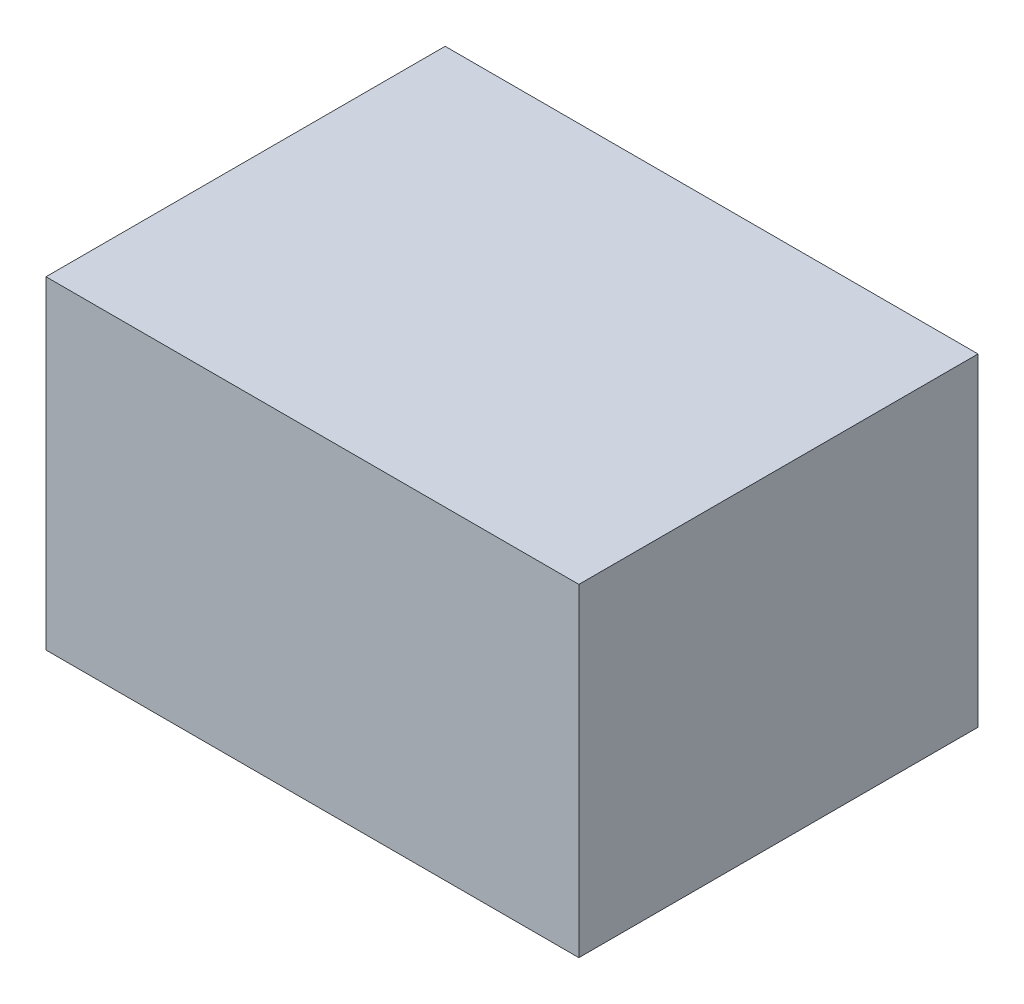
ISO-10303-21;
HEADER;
FILE_DESCRIPTION(('STEP AP214'),'2;1');
FILE_NAME('part.step','',(''),(''),'','','');
FILE_SCHEMA(('AUTOMOTIVE_DESIGN { 1 0 10303 214 1 1 1 1 }'));
ENDSEC;
DATA;
#1=APPLICATION_CONTEXT('core data for automotive mechanical design processes');
#2=APPLICATION_PROTOCOL_DEFINITION('international standard','automotive_design',2000,#1);
#3=PRODUCT_CONTEXT('',#1,'mechanical');
#4=PRODUCT('Part','Part','',(#3));
#5=PRODUCT_RELATED_PRODUCT_CATEGORY('part','',(#4));
#6=PRODUCT_DEFINITION_FORMATION('','',#4);
#7=PRODUCT_DEFINITION_CONTEXT('part definition',#1,'design');
#8=PRODUCT_DEFINITION('design','',#6,#7);
#9=PRODUCT_DEFINITION_SHAPE('','',#8);
#10=(LENGTH_UNIT() NAMED_UNIT(*) SI_UNIT(.MILLI.,.METRE.));
#11=(NAMED_UNIT(*) PLANE_ANGLE_UNIT() SI_UNIT($,.RADIAN.));
#12=(NAMED_UNIT(*) SI_UNIT($,.STERADIAN.) SOLID_ANGLE_UNIT());
#13=UNCERTAINTY_MEASURE_WITH_UNIT(LENGTH_MEASURE(1.E-05),#10,'distance_accuracy_value','');
#14=(GEOMETRIC_REPRESENTATION_CONTEXT(3) GLOBAL_UNCERTAINTY_ASSIGNED_CONTEXT((#13)) GLOBAL_UNIT_ASSIGNED_CONTEXT((#10,
#11,#12)) REPRESENTATION_CONTEXT('',''));
#15=CARTESIAN_POINT('',(0.,0.,0.));
#16=DIRECTION('',(0.,0.,1.));
#17=DIRECTION('',(1.,0.,0.));
#18=AXIS2_PLACEMENT_3D('',#15,#16,#17);
#19=CARTESIAN_POINT('',(0.,0.,3.5));
#20=DIRECTION('',(0.,0.,1.));
#21=DIRECTION('',(1.,0.,0.));
#22=AXIS2_PLACEMENT_3D('',#19,#20,#21);
#23=PLANE('',#22);
#24=DIRECTION('',(0.,-1.,0.));
#25=VECTOR('',#24,1.);
#26=CARTESIAN_POINT('',(-13.35,-8.1,3.5));
#27=LINE('',#26,#25);
#28=CARTESIAN_POINT('',(-13.35,8.1,3.5));
#29=VERTEX_POINT('',#28);
#30=CARTESIAN_POINT('',(-13.35,-8.1,3.5));
#31=VERTEX_POINT('',#30);
#32=EDGE_CURVE('E195',#29,#31,#27,.T.);
#33=ORIENTED_EDGE('',*,*,#32,.T.);
#34=DIRECTION('',(1.,0.,0.));
#35=VECTOR('',#34,1.);
#36=CARTESIAN_POINT('',(13.35,-8.1,3.5));
#37=LINE('',#36,#35);
#38=CARTESIAN_POINT('',(13.35,-8.1,3.5));
#39=VERTEX_POINT('',#38);
#40=EDGE_CURVE('E228',#31,#39,#37,.T.);
#41=ORIENTED_EDGE('',*,*,#40,.T.);
#42=DIRECTION('',(0.,1.,0.));
#43=VECTOR('',#42,1.);
#44=CARTESIAN_POINT('',(13.35,-8.1,3.5));
#45=LINE('',#44,#43);
#46=CARTESIAN_POINT('',(13.35,8.1,3.5));
#47=VERTEX_POINT('',#46);
#48=EDGE_CURVE('E232',#39,#47,#45,.T.);
#49=ORIENTED_EDGE('',*,*,#48,.T.);
#50=DIRECTION('',(-1.,0.,0.));
#51=VECTOR('',#50,1.);
#52=CARTESIAN_POINT('',(13.35,8.1,3.5));
#53=LINE('',#52,#51);
#54=EDGE_CURVE('E212',#47,#29,#53,.T.);
#55=ORIENTED_EDGE('',*,*,#54,.T.);
#56=EDGE_LOOP('',(#33,#41,#49,#55));
#57=FACE_BOUND('',#56,.T.);
#58=ADVANCED_FACE('F45',(#57),#23,.T.);
#59=CARTESIAN_POINT('',(-11.35,-6.1,-16.5));
#60=DIRECTION('',(-1.,0.,0.));
#61=DIRECTION('',(0.,0.,1.));
#62=AXIS2_PLACEMENT_3D('',#59,#60,#61);
#63=PLANE('',#62);
#64=DIRECTION('',(0.,1.,0.));
#65=VECTOR('',#64,1.);
#66=CARTESIAN_POINT('',(-11.35,-5.1,-3.));
#67=LINE('',#66,#65);
#68=CARTESIAN_POINT('',(-11.35,-5.1,-3.));
#69=VERTEX_POINT('',#68);
#70=CARTESIAN_POINT('',(-11.35,5.1,-3.));
#71=VERTEX_POINT('',#70);
#72=EDGE_CURVE('E141',#69,#71,#67,.T.);
#73=ORIENTED_EDGE('',*,*,#72,.F.);
#74=DIRECTION('',(0.,0.,-1.));
#75=VECTOR('',#74,1.);
#76=CARTESIAN_POINT('',(-11.35,-5.1,-3.));
#77=LINE('',#76,#75);
#78=CARTESIAN_POINT('',(-11.35,-5.1,0.));
#79=VERTEX_POINT('',#78);
#80=EDGE_CURVE('E174',#79,#69,#77,.T.);
#81=ORIENTED_EDGE('',*,*,#80,.F.);
#82=DIRECTION('',(0.,-1.,0.));
#83=VECTOR('',#82,1.);
#84=CARTESIAN_POINT('',(-11.35,-6.1,0.));
#85=LINE('',#84,#83);
#86=CARTESIAN_POINT('',(-11.35,-6.1,0.));
#87=VERTEX_POINT('',#86);
#88=EDGE_CURVE('E242',#79,#87,#85,.T.);
#89=ORIENTED_EDGE('',*,*,#88,.T.);
#90=DIRECTION('',(0.,0.,1.));
#91=VECTOR('',#90,1.);
#92=CARTESIAN_POINT('',(-11.35,-6.1,-16.5));
#93=LINE('',#92,#91);
#94=CARTESIAN_POINT('',(-11.35,-6.1,-16.5));
#95=VERTEX_POINT('',#94);
#96=EDGE_CURVE('E190',#95,#87,#93,.T.);
#97=ORIENTED_EDGE('',*,*,#96,.F.);
#98=DIRECTION('',(0.,-1.,0.));
#99=VECTOR('',#98,1.);
#100=CARTESIAN_POINT('',(-11.35,-6.1,-16.5));
#101=LINE('',#100,#99);
#102=CARTESIAN_POINT('',(-11.35,6.1,-16.5));
#103=VERTEX_POINT('',#102);
#104=EDGE_CURVE('E173',#103,#95,#101,.T.);
#105=ORIENTED_EDGE('',*,*,#104,.F.);
#106=DIRECTION('',(0.,0.,1.));
#107=VECTOR('',#106,1.);
#108=CARTESIAN_POINT('',(-11.35,6.1,-16.5));
#109=LINE('',#108,#107);
#110=CARTESIAN_POINT('',(-11.35,6.1,0.));
#111=VERTEX_POINT('',#110);
#112=EDGE_CURVE('E191',#103,#111,#109,.T.);
#113=ORIENTED_EDGE('',*,*,#112,.T.);
#114=CARTESIAN_POINT('',(-11.35,5.1,0.));
#115=VERTEX_POINT('',#114);
#116=EDGE_CURVE('E251',#111,#115,#85,.T.);
#117=ORIENTED_EDGE('',*,*,#116,.T.);
#118=DIRECTION('',(0.,0.,1.));
#119=VECTOR('',#118,1.);
#120=CARTESIAN_POINT('',(-11.35,5.1,-3.));
#121=LINE('',#120,#119);
#122=EDGE_CURVE('E170',#71,#115,#121,.T.);
#123=ORIENTED_EDGE('',*,*,#122,.F.);
#124=EDGE_LOOP('',(#73,#81,#89,#97,#105,#113,#117,#123));
#125=FACE_BOUND('',#124,.T.);
#126=ADVANCED_FACE('F285',(#125),#63,.F.);
#127=CARTESIAN_POINT('',(11.35,6.1,-16.5));
#128=DIRECTION('',(0.,1.,0.));
#129=DIRECTION('',(0.,0.,1.));
#130=AXIS2_PLACEMENT_3D('',#127,#128,#129);
#131=PLANE('',#130);
#132=DIRECTION('',(0.,0.,1.));
#133=VECTOR('',#132,1.);
#134=CARTESIAN_POINT('',(11.35,6.1,-16.5));
#135=LINE('',#134,#133);
#136=CARTESIAN_POINT('',(11.35,6.1,-16.5));
#137=VERTEX_POINT('',#136);
#138=CARTESIAN_POINT('',(11.35,6.1,0.));
#139=VERTEX_POINT('',#138);
#140=EDGE_CURVE('E196',#137,#139,#135,.T.);
#141=ORIENTED_EDGE('',*,*,#140,.T.);
#142=DIRECTION('',(-1.,0.,0.));
#143=VECTOR('',#142,1.);
#144=CARTESIAN_POINT('',(11.35,6.1,0.));
#145=LINE('',#144,#143);
#146=EDGE_CURVE('E11',#139,#111,#145,.T.);
#147=ORIENTED_EDGE('',*,*,#146,.T.);
#148=ORIENTED_EDGE('',*,*,#112,.F.);
#149=DIRECTION('',(-1.,0.,0.));
#150=VECTOR('',#149,1.);
#151=CARTESIAN_POINT('',(11.35,6.1,-16.5));
#152=LINE('',#151,#150);
#153=EDGE_CURVE('E186',#137,#103,#152,.T.);
#154=ORIENTED_EDGE('',*,*,#153,.F.);
#155=EDGE_LOOP('',(#141,#147,#148,#154));
#156=FACE_BOUND('',#155,.T.);
#157=ADVANCED_FACE('F266',(#156),#131,.F.);
#158=CARTESIAN_POINT('',(11.35,-6.1,-16.5));
#159=DIRECTION('',(1.,0.,0.));
#160=DIRECTION('',(0.,0.,-1.));
#161=AXIS2_PLACEMENT_3D('',#158,#159,#160);
#162=PLANE('',#161);
#163=DIRECTION('',(0.,0.,1.));
#164=VECTOR('',#163,1.);
#165=CARTESIAN_POINT('',(11.35,-6.1,-16.5));
#166=LINE('',#165,#164);
#167=CARTESIAN_POINT('',(11.35,-6.1,-16.5));
#168=VERTEX_POINT('',#167);
#169=CARTESIAN_POINT('',(11.35,-6.1,0.));
#170=VERTEX_POINT('',#169);
#171=EDGE_CURVE('E200',#168,#170,#166,.T.);
#172=ORIENTED_EDGE('',*,*,#171,.T.);
#173=DIRECTION('',(0.,1.,0.));
#174=VECTOR('',#173,1.);
#175=CARTESIAN_POINT('',(11.35,-6.1,0.));
#176=LINE('',#175,#174);
#177=EDGE_CURVE('E54',#170,#139,#176,.T.);
#178=ORIENTED_EDGE('',*,*,#177,.T.);
#179=ORIENTED_EDGE('',*,*,#140,.F.);
#180=DIRECTION('',(0.,1.,0.));
#181=VECTOR('',#180,1.);
#182=CARTESIAN_POINT('',(11.35,-6.1,-16.5));
#183=LINE('',#182,#181);
#184=EDGE_CURVE('E182',#168,#137,#183,.T.);
#185=ORIENTED_EDGE('',*,*,#184,.F.);
#186=EDGE_LOOP('',(#172,#178,#179,#185));
#187=FACE_BOUND('',#186,.T.);
#188=ADVANCED_FACE('F261',(#187),#162,.F.);
#189=CARTESIAN_POINT('',(11.35,-6.1,-16.5));
#190=DIRECTION('',(0.,-1.,0.));
#191=DIRECTION('',(0.,0.,-1.));
#192=AXIS2_PLACEMENT_3D('',#189,#190,#191);
#193=PLANE('',#192);
#194=ORIENTED_EDGE('',*,*,#96,.T.);
#195=DIRECTION('',(1.,0.,0.));
#196=VECTOR('',#195,1.);
#197=CARTESIAN_POINT('',(11.35,-6.1,0.));
#198=LINE('',#197,#196);
#199=EDGE_CURVE('E255',#87,#170,#198,.T.);
#200=ORIENTED_EDGE('',*,*,#199,.T.);
#201=ORIENTED_EDGE('',*,*,#171,.F.);
#202=DIRECTION('',(1.,0.,0.));
#203=VECTOR('',#202,1.);
#204=CARTESIAN_POINT('',(11.35,-6.1,-16.5));
#205=LINE('',#204,#203);
#206=EDGE_CURVE('E178',#95,#168,#205,.T.);
#207=ORIENTED_EDGE('',*,*,#206,.F.);
#208=EDGE_LOOP('',(#194,#200,#201,#207));
#209=FACE_BOUND('',#208,.T.);
#210=ADVANCED_FACE('F273',(#209),#193,.F.);
#211=CARTESIAN_POINT('',(-13.35,-8.1,-16.5));
#212=DIRECTION('',(-1.,0.,0.));
#213=DIRECTION('',(0.,0.,1.));
#214=AXIS2_PLACEMENT_3D('',#211,#212,#213);
#215=PLANE('',#214);
#216=DIRECTION('',(0.,1.,0.));
#217=VECTOR('',#216,1.);
#218=CARTESIAN_POINT('',(-13.35,-5.1,0.));
#219=LINE('',#218,#217);
#220=CARTESIAN_POINT('',(-13.35,-5.1,0.));
#221=VERTEX_POINT('',#220);
#222=CARTESIAN_POINT('',(-13.35,5.1,0.));
#223=VERTEX_POINT('',#222);
#224=EDGE_CURVE('E61',#221,#223,#219,.T.);
#225=ORIENTED_EDGE('',*,*,#224,.F.);
#226=DIRECTION('',(0.,0.,1.));
#227=VECTOR('',#226,1.);
#228=CARTESIAN_POINT('',(-13.35,-5.1,-3.));
#229=LINE('',#228,#227);
#230=CARTESIAN_POINT('',(-13.35,-5.1,-3.));
#231=VERTEX_POINT('',#230);
#232=EDGE_CURVE('E156',#231,#221,#229,.T.);
#233=ORIENTED_EDGE('',*,*,#232,.F.);
#234=DIRECTION('',(0.,-1.,0.));
#235=VECTOR('',#234,1.);
#236=CARTESIAN_POINT('',(-13.35,-5.1,-3.));
#237=LINE('',#236,#235);
#238=CARTESIAN_POINT('',(-13.35,5.1,-3.));
#239=VERTEX_POINT('',#238);
#240=EDGE_CURVE('E138',#239,#231,#237,.T.);
#241=ORIENTED_EDGE('',*,*,#240,.F.);
#242=DIRECTION('',(0.,0.,-1.));
#243=VECTOR('',#242,1.);
#244=CARTESIAN_POINT('',(-13.35,5.1,-3.));
#245=LINE('',#244,#243);
#246=EDGE_CURVE('E148',#223,#239,#245,.T.);
#247=ORIENTED_EDGE('',*,*,#246,.F.);
#248=EDGE_LOOP('',(#225,#233,#241,#247));
#249=FACE_BOUND('',#248,.T.);
#250=ORIENTED_EDGE('',*,*,#32,.F.);
#251=DIRECTION('',(0.,0.,1.));
#252=VECTOR('',#251,1.);
#253=CARTESIAN_POINT('',(-13.35,8.1,-16.5));
#254=LINE('',#253,#252);
#255=CARTESIAN_POINT('',(-13.35,8.1,-16.5));
#256=VERTEX_POINT('',#255);
#257=EDGE_CURVE('E239',#256,#29,#254,.T.);
#258=ORIENTED_EDGE('',*,*,#257,.F.);
#259=DIRECTION('',(0.,-1.,0.));
#260=VECTOR('',#259,1.);
#261=CARTESIAN_POINT('',(-13.35,-8.1,-16.5));
#262=LINE('',#261,#260);
#263=CARTESIAN_POINT('',(-13.35,-8.1,-16.5));
#264=VERTEX_POINT('',#263);
#265=EDGE_CURVE('E207',#256,#264,#262,.T.);
#266=ORIENTED_EDGE('',*,*,#265,.T.);
#267=DIRECTION('',(0.,0.,1.));
#268=VECTOR('',#267,1.);
#269=CARTESIAN_POINT('',(-13.35,-8.1,-16.5));
#270=LINE('',#269,#268);
#271=EDGE_CURVE('E224',#264,#31,#270,.T.);
#272=ORIENTED_EDGE('',*,*,#271,.T.);
#273=EDGE_LOOP('',(#250,#258,#266,#272));
#274=FACE_BOUND('',#273,.T.);
#275=ADVANCED_FACE('F153',(#249,#274),#215,.T.);
#276=CARTESIAN_POINT('',(13.35,8.1,-16.5));
#277=DIRECTION('',(0.,1.,0.));
#278=DIRECTION('',(0.,0.,1.));
#279=AXIS2_PLACEMENT_3D('',#276,#277,#278);
#280=PLANE('',#279);
#281=ORIENTED_EDGE('',*,*,#54,.F.);
#282=DIRECTION('',(0.,0.,1.));
#283=VECTOR('',#282,1.);
#284=CARTESIAN_POINT('',(13.35,8.1,-16.5));
#285=LINE('',#284,#283);
#286=CARTESIAN_POINT('',(13.35,8.1,-16.5));
#287=VERTEX_POINT('',#286);
#288=EDGE_CURVE('E243',#287,#47,#285,.T.);
#289=ORIENTED_EDGE('',*,*,#288,.F.);
#290=DIRECTION('',(-1.,0.,0.));
#291=VECTOR('',#290,1.);
#292=CARTESIAN_POINT('',(13.35,8.1,-16.5));
#293=LINE('',#292,#291);
#294=EDGE_CURVE('E220',#287,#256,#293,.T.);
#295=ORIENTED_EDGE('',*,*,#294,.T.);
#296=ORIENTED_EDGE('',*,*,#257,.T.);
#297=EDGE_LOOP('',(#281,#289,#295,#296));
#298=FACE_BOUND('',#297,.T.);
#299=ADVANCED_FACE('F301',(#298),#280,.T.);
#300=CARTESIAN_POINT('',(13.35,-8.1,-16.5));
#301=DIRECTION('',(1.,0.,0.));
#302=DIRECTION('',(0.,0.,-1.));
#303=AXIS2_PLACEMENT_3D('',#300,#301,#302);
#304=PLANE('',#303);
#305=ORIENTED_EDGE('',*,*,#48,.F.);
#306=DIRECTION('',(0.,0.,1.));
#307=VECTOR('',#306,1.);
#308=CARTESIAN_POINT('',(13.35,-8.1,-16.5));
#309=LINE('',#308,#307);
#310=CARTESIAN_POINT('',(13.35,-8.1,-16.5));
#311=VERTEX_POINT('',#310);
#312=EDGE_CURVE('E246',#311,#39,#309,.T.);
#313=ORIENTED_EDGE('',*,*,#312,.F.);
#314=DIRECTION('',(0.,1.,0.));
#315=VECTOR('',#314,1.);
#316=CARTESIAN_POINT('',(13.35,-8.1,-16.5));
#317=LINE('',#316,#315);
#318=EDGE_CURVE('E216',#311,#287,#317,.T.);
#319=ORIENTED_EDGE('',*,*,#318,.T.);
#320=ORIENTED_EDGE('',*,*,#288,.T.);
#321=EDGE_LOOP('',(#305,#313,#319,#320));
#322=FACE_BOUND('',#321,.T.);
#323=ADVANCED_FACE('F304',(#322),#304,.T.);
#324=CARTESIAN_POINT('',(13.35,-8.1,-16.5));
#325=DIRECTION('',(0.,-1.,0.));
#326=DIRECTION('',(0.,0.,-1.));
#327=AXIS2_PLACEMENT_3D('',#324,#325,#326);
#328=PLANE('',#327);
#329=ORIENTED_EDGE('',*,*,#40,.F.);
#330=ORIENTED_EDGE('',*,*,#271,.F.);
#331=DIRECTION('',(1.,0.,0.));
#332=VECTOR('',#331,1.);
#333=CARTESIAN_POINT('',(13.35,-8.1,-16.5));
#334=LINE('',#333,#332);
#335=EDGE_CURVE('E211',#264,#311,#334,.T.);
#336=ORIENTED_EDGE('',*,*,#335,.T.);
#337=ORIENTED_EDGE('',*,*,#312,.T.);
#338=EDGE_LOOP('',(#329,#330,#336,#337));
#339=FACE_BOUND('',#338,.T.);
#340=ADVANCED_FACE('F300',(#339),#328,.T.);
#341=CARTESIAN_POINT('',(0.,0.,-16.5));
#342=DIRECTION('',(0.,0.,1.));
#343=DIRECTION('',(1.,0.,0.));
#344=AXIS2_PLACEMENT_3D('',#341,#342,#343);
#345=PLANE('',#344);
#346=ORIENTED_EDGE('',*,*,#153,.T.);
#347=ORIENTED_EDGE('',*,*,#104,.T.);
#348=ORIENTED_EDGE('',*,*,#206,.T.);
#349=ORIENTED_EDGE('',*,*,#184,.T.);
#350=EDGE_LOOP('',(#346,#347,#348,#349));
#351=FACE_BOUND('',#350,.T.);
#352=ORIENTED_EDGE('',*,*,#265,.F.);
#353=ORIENTED_EDGE('',*,*,#294,.F.);
#354=ORIENTED_EDGE('',*,*,#318,.F.);
#355=ORIENTED_EDGE('',*,*,#335,.F.);
#356=EDGE_LOOP('',(#352,#353,#354,#355));
#357=FACE_BOUND('',#356,.T.);
#358=ADVANCED_FACE('F269',(#351,#357),#345,.F.);
#359=CARTESIAN_POINT('',(0.,0.,0.));
#360=DIRECTION('',(0.,0.,1.));
#361=DIRECTION('',(1.,0.,0.));
#362=AXIS2_PLACEMENT_3D('',#359,#360,#361);
#363=PLANE('',#362);
#364=ORIENTED_EDGE('',*,*,#116,.F.);
#365=ORIENTED_EDGE('',*,*,#146,.F.);
#366=ORIENTED_EDGE('',*,*,#177,.F.);
#367=ORIENTED_EDGE('',*,*,#199,.F.);
#368=ORIENTED_EDGE('',*,*,#88,.F.);
#369=DIRECTION('',(-1.,0.,0.));
#370=VECTOR('',#369,1.);
#371=CARTESIAN_POINT('',(-0.717972911998391,-5.1,0.));
#372=LINE('',#371,#370);
#373=EDGE_CURVE('E163',#79,#221,#372,.T.);
#374=ORIENTED_EDGE('',*,*,#373,.T.);
#375=ORIENTED_EDGE('',*,*,#224,.T.);
#376=DIRECTION('',(-1.,0.,0.));
#377=VECTOR('',#376,1.);
#378=CARTESIAN_POINT('',(-0.717972911998391,5.1,0.));
#379=LINE('',#378,#377);
#380=EDGE_CURVE('E65',#115,#223,#379,.T.);
#381=ORIENTED_EDGE('',*,*,#380,.F.);
#382=EDGE_LOOP('',(#364,#365,#366,#367,#368,#374,#375,#381));
#383=FACE_BOUND('',#382,.T.);
#384=ADVANCED_FACE('F47',(#383),#363,.F.);
#385=CARTESIAN_POINT('',(-0.717972911998391,-5.1,-3.));
#386=DIRECTION('',(0.,-1.,0.));
#387=DIRECTION('',(0.,0.,-1.));
#388=AXIS2_PLACEMENT_3D('',#385,#386,#387);
#389=PLANE('',#388);
#390=ORIENTED_EDGE('',*,*,#80,.T.);
#391=DIRECTION('',(-1.,0.,0.));
#392=VECTOR('',#391,1.);
#393=CARTESIAN_POINT('',(-0.717972911998391,-5.1,-3.));
#394=LINE('',#393,#392);
#395=EDGE_CURVE('E145',#69,#231,#394,.T.);
#396=ORIENTED_EDGE('',*,*,#395,.T.);
#397=ORIENTED_EDGE('',*,*,#232,.T.);
#398=ORIENTED_EDGE('',*,*,#373,.F.);
#399=EDGE_LOOP('',(#390,#396,#397,#398));
#400=FACE_BOUND('',#399,.T.);
#401=ADVANCED_FACE('F284',(#400),#389,.F.);
#402=CARTESIAN_POINT('',(-0.717972911998391,-5.1,-3.));
#403=DIRECTION('',(0.,0.,-1.));
#404=DIRECTION('',(-1.,0.,0.));
#405=AXIS2_PLACEMENT_3D('',#402,#403,#404);
#406=PLANE('',#405);
#407=ORIENTED_EDGE('',*,*,#72,.T.);
#408=DIRECTION('',(-1.,0.,0.));
#409=VECTOR('',#408,1.);
#410=CARTESIAN_POINT('',(-0.717972911998391,5.1,-3.));
#411=LINE('',#410,#409);
#412=EDGE_CURVE('E133',#71,#239,#411,.T.);
#413=ORIENTED_EDGE('',*,*,#412,.T.);
#414=ORIENTED_EDGE('',*,*,#240,.T.);
#415=ORIENTED_EDGE('',*,*,#395,.F.);
#416=EDGE_LOOP('',(#407,#413,#414,#415));
#417=FACE_BOUND('',#416,.T.);
#418=ADVANCED_FACE('F135',(#417),#406,.F.);
#419=CARTESIAN_POINT('',(-0.717972911998391,5.1,-3.));
#420=DIRECTION('',(0.,1.,0.));
#421=DIRECTION('',(0.,0.,1.));
#422=AXIS2_PLACEMENT_3D('',#419,#420,#421);
#423=PLANE('',#422);
#424=ORIENTED_EDGE('',*,*,#122,.T.);
#425=ORIENTED_EDGE('',*,*,#380,.T.);
#426=ORIENTED_EDGE('',*,*,#246,.T.);
#427=ORIENTED_EDGE('',*,*,#412,.F.);
#428=EDGE_LOOP('',(#424,#425,#426,#427));
#429=FACE_BOUND('',#428,.T.);
#430=ADVANCED_FACE('F149',(#429),#423,.F.);
#431=CLOSED_SHELL('',(#58,#126,#157,#188,#210,#275,#299,#323,#340,#358,#384,#401,#418,#430));
#432=MANIFOLD_SOLID_BREP('B2',#431);
#433=ADVANCED_BREP_SHAPE_REPRESENTATION('',(#18,#432),#14);
#434=SHAPE_DEFINITION_REPRESENTATION(#9,#433);
ENDSEC;
END-ISO-10303-21;
